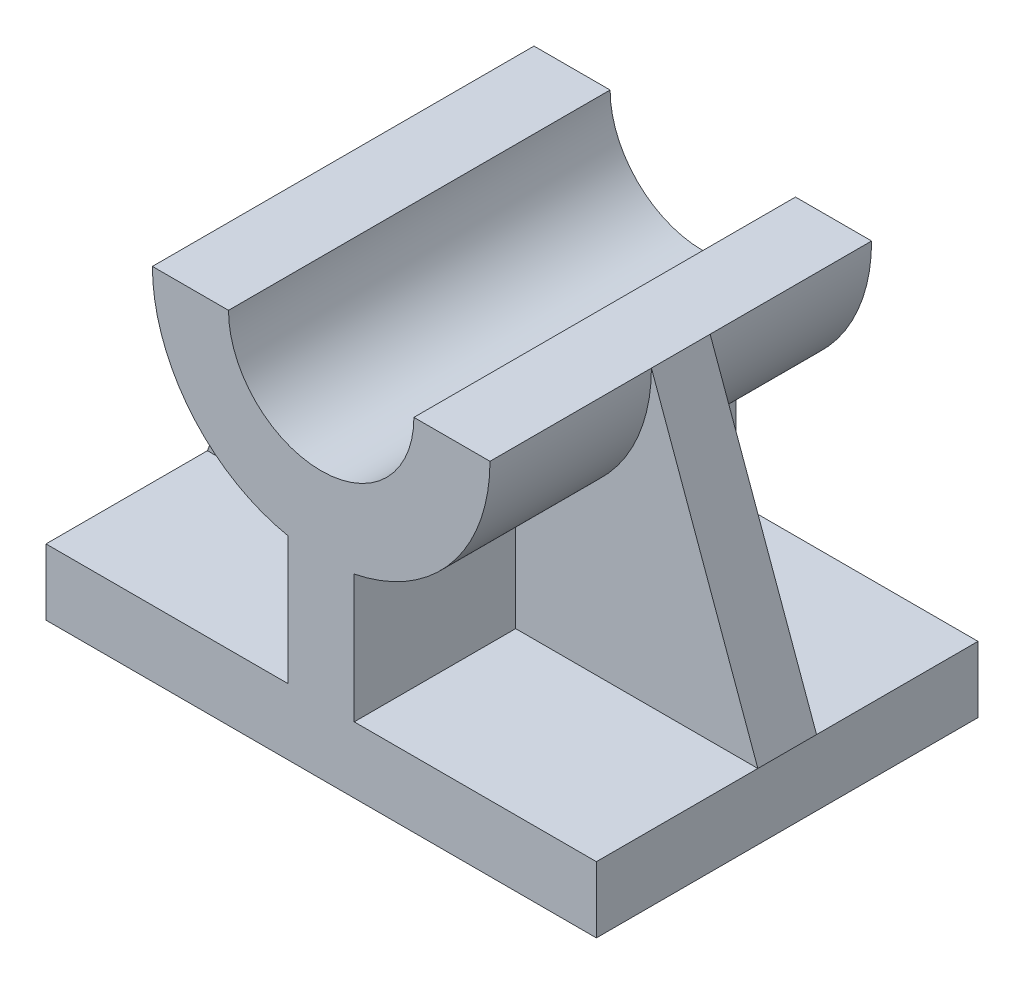
ISO-10303-21;
HEADER;
FILE_DESCRIPTION(('STEP AP214'),'2;1');
FILE_NAME('part.step','',(''),(''),'','','');
FILE_SCHEMA(('AUTOMOTIVE_DESIGN { 1 0 10303 214 1 1 1 1 }'));
ENDSEC;
DATA;
#1=APPLICATION_CONTEXT('core data for automotive mechanical design processes');
#2=APPLICATION_PROTOCOL_DEFINITION('international standard','automotive_design',2000,#1);
#3=PRODUCT_CONTEXT('',#1,'mechanical');
#4=PRODUCT('Part','Part','',(#3));
#5=PRODUCT_RELATED_PRODUCT_CATEGORY('part','',(#4));
#6=PRODUCT_DEFINITION_FORMATION('','',#4);
#7=PRODUCT_DEFINITION_CONTEXT('part definition',#1,'design');
#8=PRODUCT_DEFINITION('design','',#6,#7);
#9=PRODUCT_DEFINITION_SHAPE('','',#8);
#10=(LENGTH_UNIT() NAMED_UNIT(*) SI_UNIT(.MILLI.,.METRE.));
#11=(NAMED_UNIT(*) PLANE_ANGLE_UNIT() SI_UNIT($,.RADIAN.));
#12=(NAMED_UNIT(*) SI_UNIT($,.STERADIAN.) SOLID_ANGLE_UNIT());
#13=UNCERTAINTY_MEASURE_WITH_UNIT(LENGTH_MEASURE(1.E-05),#10,'distance_accuracy_value','');
#14=(GEOMETRIC_REPRESENTATION_CONTEXT(3) GLOBAL_UNCERTAINTY_ASSIGNED_CONTEXT((#13)) GLOBAL_UNIT_ASSIGNED_CONTEXT((#10,
#11,#12)) REPRESENTATION_CONTEXT('',''));
#15=CARTESIAN_POINT('',(0.,0.,0.));
#16=DIRECTION('',(0.,0.,1.));
#17=DIRECTION('',(1.,0.,0.));
#18=AXIS2_PLACEMENT_3D('',#15,#16,#17);
#19=CARTESIAN_POINT('',(0.,44500.,26000.));
#20=DIRECTION('',(0.,0.,-1.));
#21=DIRECTION('',(-1.,0.,0.));
#22=AXIS2_PLACEMENT_3D('',#19,#20,#21);
#23=CYLINDRICAL_SURFACE('',#22,23000.);
#24=CARTESIAN_POINT('',(0.,44500.,-4000.));
#25=DIRECTION('',(0.,0.,1.));
#26=DIRECTION('',(1.,0.,0.));
#27=AXIS2_PLACEMENT_3D('',#24,#25,#26);
#28=CIRCLE('',#27,23000.);
#29=CARTESIAN_POINT('',(-23000.,44500.,-4000.));
#30=VERTEX_POINT('',#29);
#31=CARTESIAN_POINT('',(-4500.00000000001,21944.5128627201,-4000.));
#32=VERTEX_POINT('',#31);
#33=EDGE_CURVE('E190',#30,#32,#28,.T.);
#34=ORIENTED_EDGE('',*,*,#33,.F.);
#35=DIRECTION('',(0.,0.,-1.));
#36=VECTOR('',#35,1.);
#37=CARTESIAN_POINT('',(-23000.,44500.,26000.));
#38=LINE('',#37,#36);
#39=CARTESIAN_POINT('',(-23000.,44500.,-26000.));
#40=VERTEX_POINT('',#39);
#41=EDGE_CURVE('E199',#30,#40,#38,.T.);
#42=ORIENTED_EDGE('',*,*,#41,.T.);
#43=CARTESIAN_POINT('',(0.,44500.,-26000.));
#44=DIRECTION('',(0.,0.,1.));
#45=DIRECTION('',(1.,0.,0.));
#46=AXIS2_PLACEMENT_3D('',#43,#44,#45);
#47=CIRCLE('',#46,23000.);
#48=CARTESIAN_POINT('',(-4500.00000000001,21944.5128627201,-26000.));
#49=VERTEX_POINT('',#48);
#50=EDGE_CURVE('E272',#40,#49,#47,.T.);
#51=ORIENTED_EDGE('',*,*,#50,.T.);
#52=DIRECTION('',(0.,0.,-1.));
#53=VECTOR('',#52,1.);
#54=CARTESIAN_POINT('',(-4500.00000000001,21944.5128627201,26000.));
#55=LINE('',#54,#53);
#56=EDGE_CURVE('E201',#32,#49,#55,.T.);
#57=ORIENTED_EDGE('',*,*,#56,.F.);
#58=EDGE_LOOP('',(#34,#42,#51,#57));
#59=FACE_BOUND('',#58,.T.);
#60=ADVANCED_FACE('F41',(#59),#23,.T.);
#61=CARTESIAN_POINT('',(-4500.00000000001,21944.5128627201,26000.));
#62=DIRECTION('',(1.,0.,0.));
#63=DIRECTION('',(0.,1.,0.));
#64=AXIS2_PLACEMENT_3D('',#61,#62,#63);
#65=PLANE('',#64);
#66=DIRECTION('',(0.,-1.,0.));
#67=VECTOR('',#66,1.);
#68=CARTESIAN_POINT('',(-4500.00000000001,21944.5128627201,-4000.));
#69=LINE('',#68,#67);
#70=CARTESIAN_POINT('',(-4500.00000000001,4500.,-4000.));
#71=VERTEX_POINT('',#70);
#72=EDGE_CURVE('E203',#32,#71,#69,.T.);
#73=ORIENTED_EDGE('',*,*,#72,.F.);
#74=ORIENTED_EDGE('',*,*,#56,.T.);
#75=DIRECTION('',(0.,-1.,0.));
#76=VECTOR('',#75,1.);
#77=CARTESIAN_POINT('',(-4500.00000000001,21944.5128627201,-26000.));
#78=LINE('',#77,#76);
#79=CARTESIAN_POINT('',(-4500.00000000001,4500.,-26000.));
#80=VERTEX_POINT('',#79);
#81=EDGE_CURVE('E274',#49,#80,#78,.T.);
#82=ORIENTED_EDGE('',*,*,#81,.T.);
#83=DIRECTION('',(0.,0.,-1.));
#84=VECTOR('',#83,1.);
#85=CARTESIAN_POINT('',(-4500.00000000001,4500.,26000.));
#86=LINE('',#85,#84);
#87=EDGE_CURVE('E295',#71,#80,#86,.T.);
#88=ORIENTED_EDGE('',*,*,#87,.F.);
#89=EDGE_LOOP('',(#73,#74,#82,#88));
#90=FACE_BOUND('',#89,.T.);
#91=ADVANCED_FACE('F310',(#90),#65,.F.);
#92=CARTESIAN_POINT('',(-37500.,4500.,26000.));
#93=DIRECTION('',(0.,-1.,0.));
#94=DIRECTION('',(0.,0.,-1.));
#95=AXIS2_PLACEMENT_3D('',#92,#93,#94);
#96=PLANE('',#95);
#97=DIRECTION('',(-1.,0.,0.));
#98=VECTOR('',#97,1.);
#99=CARTESIAN_POINT('',(-37500.,4500.,-4000.));
#100=LINE('',#99,#98);
#101=CARTESIAN_POINT('',(-37500.,4500.,-4000.));
#102=VERTEX_POINT('',#101);
#103=EDGE_CURVE('E193',#71,#102,#100,.T.);
#104=ORIENTED_EDGE('',*,*,#103,.F.);
#105=ORIENTED_EDGE('',*,*,#87,.T.);
#106=DIRECTION('',(-1.,0.,0.));
#107=VECTOR('',#106,1.);
#108=CARTESIAN_POINT('',(-37500.,4500.,-26000.));
#109=LINE('',#108,#107);
#110=CARTESIAN_POINT('',(-37500.,4500.,-26000.));
#111=VERTEX_POINT('',#110);
#112=EDGE_CURVE('E277',#80,#111,#109,.T.);
#113=ORIENTED_EDGE('',*,*,#112,.T.);
#114=DIRECTION('',(0.,0.,-1.));
#115=VECTOR('',#114,1.);
#116=CARTESIAN_POINT('',(-37500.,4500.,26000.));
#117=LINE('',#116,#115);
#118=EDGE_CURVE('E292',#102,#111,#117,.T.);
#119=ORIENTED_EDGE('',*,*,#118,.F.);
#120=EDGE_LOOP('',(#104,#105,#113,#119));
#121=FACE_BOUND('',#120,.T.);
#122=ADVANCED_FACE('F305',(#121),#96,.F.);
#123=CARTESIAN_POINT('',(4500.,4500.00000000003,26000.));
#124=DIRECTION('',(0.,-1.,0.));
#125=DIRECTION('',(1.,0.,0.));
#126=AXIS2_PLACEMENT_3D('',#123,#124,#125);
#127=PLANE('',#126);
#128=DIRECTION('',(-1.,0.,0.));
#129=VECTOR('',#128,1.);
#130=CARTESIAN_POINT('',(4500.,4500.00000000003,-4000.));
#131=LINE('',#130,#129);
#132=CARTESIAN_POINT('',(37500.,4499.99999999999,-4000.));
#133=VERTEX_POINT('',#132);
#134=CARTESIAN_POINT('',(4500.,4500.00000000003,-4000.));
#135=VERTEX_POINT('',#134);
#136=EDGE_CURVE('E337',#133,#135,#131,.T.);
#137=ORIENTED_EDGE('',*,*,#136,.F.);
#138=DIRECTION('',(0.,0.,-1.));
#139=VECTOR('',#138,1.);
#140=CARTESIAN_POINT('',(37500.,4500.,26000.));
#141=LINE('',#140,#139);
#142=CARTESIAN_POINT('',(37500.,4500.,-26000.));
#143=VERTEX_POINT('',#142);
#144=EDGE_CURVE('E49',#133,#143,#141,.T.);
#145=ORIENTED_EDGE('',*,*,#144,.T.);
#146=DIRECTION('',(-1.,0.,0.));
#147=VECTOR('',#146,1.);
#148=CARTESIAN_POINT('',(4500.,4500.00000000003,-26000.));
#149=LINE('',#148,#147);
#150=CARTESIAN_POINT('',(4500.,4500.00000000003,-26000.));
#151=VERTEX_POINT('',#150);
#152=EDGE_CURVE('E249',#143,#151,#149,.T.);
#153=ORIENTED_EDGE('',*,*,#152,.T.);
#154=DIRECTION('',(0.,0.,-1.));
#155=VECTOR('',#154,1.);
#156=CARTESIAN_POINT('',(4500.,4500.00000000003,26000.));
#157=LINE('',#156,#155);
#158=EDGE_CURVE('E228',#135,#151,#157,.T.);
#159=ORIENTED_EDGE('',*,*,#158,.F.);
#160=EDGE_LOOP('',(#137,#145,#153,#159));
#161=FACE_BOUND('',#160,.T.);
#162=ADVANCED_FACE('F250',(#161),#127,.F.);
#163=CARTESIAN_POINT('',(4500.00000000001,21944.5128627201,26000.));
#164=DIRECTION('',(-1.,0.,0.));
#165=DIRECTION('',(0.,-1.,0.));
#166=AXIS2_PLACEMENT_3D('',#163,#164,#165);
#167=PLANE('',#166);
#168=DIRECTION('',(0.,1.,0.));
#169=VECTOR('',#168,1.);
#170=CARTESIAN_POINT('',(4500.00000000001,21944.5128627201,-4000.));
#171=LINE('',#170,#169);
#172=CARTESIAN_POINT('',(4500.00000000001,21944.5128627201,-4000.));
#173=VERTEX_POINT('',#172);
#174=EDGE_CURVE('E245',#135,#173,#171,.T.);
#175=ORIENTED_EDGE('',*,*,#174,.F.);
#176=ORIENTED_EDGE('',*,*,#158,.T.);
#177=DIRECTION('',(0.,1.,0.));
#178=VECTOR('',#177,1.);
#179=CARTESIAN_POINT('',(4500.00000000001,21944.5128627201,-26000.));
#180=LINE('',#179,#178);
#181=CARTESIAN_POINT('',(4500.00000000001,21944.5128627201,-26000.));
#182=VERTEX_POINT('',#181);
#183=EDGE_CURVE('E243',#151,#182,#180,.T.);
#184=ORIENTED_EDGE('',*,*,#183,.T.);
#185=DIRECTION('',(0.,0.,-1.));
#186=VECTOR('',#185,1.);
#187=CARTESIAN_POINT('',(4500.00000000001,21944.5128627201,26000.));
#188=LINE('',#187,#186);
#189=EDGE_CURVE('E224',#173,#182,#188,.T.);
#190=ORIENTED_EDGE('',*,*,#189,.F.);
#191=EDGE_LOOP('',(#175,#176,#184,#190));
#192=FACE_BOUND('',#191,.T.);
#193=ADVANCED_FACE('F240',(#192),#167,.F.);
#194=CARTESIAN_POINT('',(0.,44500.,26000.));
#195=DIRECTION('',(0.,0.,-1.));
#196=DIRECTION('',(-1.,0.,0.));
#197=AXIS2_PLACEMENT_3D('',#194,#195,#196);
#198=CYLINDRICAL_SURFACE('',#197,23000.);
#199=CARTESIAN_POINT('',(0.,44500.,-4000.));
#200=DIRECTION('',(0.,0.,1.));
#201=DIRECTION('',(1.,0.,0.));
#202=AXIS2_PLACEMENT_3D('',#199,#200,#201);
#203=CIRCLE('',#202,23000.);
#204=CARTESIAN_POINT('',(23000.,44500.,-4000.));
#205=VERTEX_POINT('',#204);
#206=EDGE_CURVE('E333',#173,#205,#203,.T.);
#207=ORIENTED_EDGE('',*,*,#206,.F.);
#208=ORIENTED_EDGE('',*,*,#189,.T.);
#209=CARTESIAN_POINT('',(0.,44500.,-26000.));
#210=DIRECTION('',(0.,0.,1.));
#211=DIRECTION('',(1.,0.,0.));
#212=AXIS2_PLACEMENT_3D('',#209,#210,#211);
#213=CIRCLE('',#212,23000.);
#214=CARTESIAN_POINT('',(23000.,44500.,-26000.));
#215=VERTEX_POINT('',#214);
#216=EDGE_CURVE('E260',#182,#215,#213,.T.);
#217=ORIENTED_EDGE('',*,*,#216,.T.);
#218=DIRECTION('',(0.,0.,-1.));
#219=VECTOR('',#218,1.);
#220=CARTESIAN_POINT('',(23000.,44500.,26000.));
#221=LINE('',#220,#219);
#222=EDGE_CURVE('E220',#205,#215,#221,.T.);
#223=ORIENTED_EDGE('',*,*,#222,.F.);
#224=EDGE_LOOP('',(#207,#208,#217,#223));
#225=FACE_BOUND('',#224,.T.);
#226=ADVANCED_FACE('F403',(#225),#198,.T.);
#227=CARTESIAN_POINT('',(37500.,4500.,26000.));
#228=DIRECTION('',(-1.,0.,0.));
#229=DIRECTION('',(0.,0.,1.));
#230=AXIS2_PLACEMENT_3D('',#227,#228,#229);
#231=PLANE('',#230);
#232=DIRECTION('',(0.,0.,-1.));
#233=VECTOR('',#232,1.);
#234=CARTESIAN_POINT('',(37500.,-4500.,26000.));
#235=LINE('',#234,#233);
#236=CARTESIAN_POINT('',(37500.,-4500.,26000.));
#237=VERTEX_POINT('',#236);
#238=CARTESIAN_POINT('',(37500.,-4500.,-26000.));
#239=VERTEX_POINT('',#238);
#240=EDGE_CURVE('E287',#237,#239,#235,.T.);
#241=ORIENTED_EDGE('',*,*,#240,.T.);
#242=DIRECTION('',(0.,1.,0.));
#243=VECTOR('',#242,1.);
#244=CARTESIAN_POINT('',(37500.,4500.,-26000.));
#245=LINE('',#244,#243);
#246=EDGE_CURVE('E255',#239,#143,#245,.T.);
#247=ORIENTED_EDGE('',*,*,#246,.T.);
#248=ORIENTED_EDGE('',*,*,#144,.F.);
#249=DIRECTION('',(0.,0.,-1.));
#250=VECTOR('',#249,1.);
#251=CARTESIAN_POINT('',(37500.,4500.,26000.));
#252=LINE('',#251,#250);
#253=CARTESIAN_POINT('',(37500.,4499.99999999999,4000.));
#254=VERTEX_POINT('',#253);
#255=EDGE_CURVE('E347',#133,#254,#252,.F.);
#256=ORIENTED_EDGE('',*,*,#255,.T.);
#257=CARTESIAN_POINT('',(37500.,4500.,26000.));
#258=VERTEX_POINT('',#257);
#259=EDGE_CURVE('E11',#258,#254,#141,.T.);
#260=ORIENTED_EDGE('',*,*,#259,.F.);
#261=DIRECTION('',(0.,1.,0.));
#262=VECTOR('',#261,1.);
#263=CARTESIAN_POINT('',(37500.,4500.,26000.));
#264=LINE('',#263,#262);
#265=EDGE_CURVE('E286',#237,#258,#264,.T.);
#266=ORIENTED_EDGE('',*,*,#265,.F.);
#267=EDGE_LOOP('',(#241,#247,#248,#256,#260,#266));
#268=FACE_BOUND('',#267,.T.);
#269=ADVANCED_FACE('F43',(#268),#231,.F.);
#270=ORIENTED_EDGE('',*,*,#259,.T.);
#271=DIRECTION('',(-1.,0.,0.));
#272=VECTOR('',#271,1.);
#273=CARTESIAN_POINT('',(4500.,4500.00000000003,4000.));
#274=LINE('',#273,#272);
#275=CARTESIAN_POINT('',(4500.,4500.00000000003,4000.));
#276=VERTEX_POINT('',#275);
#277=EDGE_CURVE('E344',#254,#276,#274,.T.);
#278=ORIENTED_EDGE('',*,*,#277,.T.);
#279=CARTESIAN_POINT('',(4500.,4500.00000000003,26000.));
#280=VERTEX_POINT('',#279);
#281=EDGE_CURVE('E229',#280,#276,#157,.T.);
#282=ORIENTED_EDGE('',*,*,#281,.F.);
#283=DIRECTION('',(-1.,0.,0.));
#284=VECTOR('',#283,1.);
#285=CARTESIAN_POINT('',(4500.,4500.00000000003,26000.));
#286=LINE('',#285,#284);
#287=EDGE_CURVE('E352',#258,#280,#286,.T.);
#288=ORIENTED_EDGE('',*,*,#287,.F.);
#289=EDGE_LOOP('',(#270,#278,#282,#288));
#290=FACE_BOUND('',#289,.T.);
#291=ADVANCED_FACE('F443',(#290),#127,.F.);
#292=ORIENTED_EDGE('',*,*,#281,.T.);
#293=DIRECTION('',(0.,1.,0.));
#294=VECTOR('',#293,1.);
#295=CARTESIAN_POINT('',(4500.00000000001,21944.5128627201,4000.));
#296=LINE('',#295,#294);
#297=CARTESIAN_POINT('',(4500.00000000001,21944.5128627201,4000.));
#298=VERTEX_POINT('',#297);
#299=EDGE_CURVE('E342',#276,#298,#296,.T.);
#300=ORIENTED_EDGE('',*,*,#299,.T.);
#301=CARTESIAN_POINT('',(4500.00000000001,21944.5128627201,26000.));
#302=VERTEX_POINT('',#301);
#303=EDGE_CURVE('E226',#302,#298,#188,.T.);
#304=ORIENTED_EDGE('',*,*,#303,.F.);
#305=DIRECTION('',(0.,1.,0.));
#306=VECTOR('',#305,1.);
#307=CARTESIAN_POINT('',(4500.00000000001,21944.5128627201,26000.));
#308=LINE('',#307,#306);
#309=EDGE_CURVE('E354',#280,#302,#308,.T.);
#310=ORIENTED_EDGE('',*,*,#309,.F.);
#311=EDGE_LOOP('',(#292,#300,#304,#310));
#312=FACE_BOUND('',#311,.T.);
#313=ADVANCED_FACE('F440',(#312),#167,.F.);
#314=ORIENTED_EDGE('',*,*,#303,.T.);
#315=CARTESIAN_POINT('',(0.,44500.,4000.));
#316=DIRECTION('',(0.,0.,1.));
#317=DIRECTION('',(1.,0.,0.));
#318=AXIS2_PLACEMENT_3D('',#315,#316,#317);
#319=CIRCLE('',#318,23000.);
#320=CARTESIAN_POINT('',(23000.,44500.,4000.));
#321=VERTEX_POINT('',#320);
#322=EDGE_CURVE('E339',#298,#321,#319,.T.);
#323=ORIENTED_EDGE('',*,*,#322,.T.);
#324=CARTESIAN_POINT('',(23000.,44500.,26000.));
#325=VERTEX_POINT('',#324);
#326=EDGE_CURVE('E221',#325,#321,#221,.T.);
#327=ORIENTED_EDGE('',*,*,#326,.F.);
#328=CARTESIAN_POINT('',(0.,44500.,26000.));
#329=DIRECTION('',(0.,0.,1.));
#330=DIRECTION('',(1.,0.,0.));
#331=AXIS2_PLACEMENT_3D('',#328,#329,#330);
#332=CIRCLE('',#331,23000.);
#333=EDGE_CURVE('E356',#302,#325,#332,.T.);
#334=ORIENTED_EDGE('',*,*,#333,.F.);
#335=EDGE_LOOP('',(#314,#323,#327,#334));
#336=FACE_BOUND('',#335,.T.);
#337=ADVANCED_FACE('F437',(#336),#198,.T.);
#338=CARTESIAN_POINT('',(23000.,44500.,26000.));
#339=DIRECTION('',(0.,-1.,0.));
#340=DIRECTION('',(0.,0.,-1.));
#341=AXIS2_PLACEMENT_3D('',#338,#339,#340);
#342=PLANE('',#341);
#343=ORIENTED_EDGE('',*,*,#326,.T.);
#344=EDGE_CURVE('E225',#321,#205,#221,.T.);
#345=ORIENTED_EDGE('',*,*,#344,.T.);
#346=ORIENTED_EDGE('',*,*,#222,.T.);
#347=DIRECTION('',(-1.,0.,0.));
#348=VECTOR('',#347,1.);
#349=CARTESIAN_POINT('',(23000.,44500.,-26000.));
#350=LINE('',#349,#348);
#351=CARTESIAN_POINT('',(12632.3716415069,44500.,-26000.));
#352=VERTEX_POINT('',#351);
#353=EDGE_CURVE('E262',#215,#352,#350,.T.);
#354=ORIENTED_EDGE('',*,*,#353,.T.);
#355=DIRECTION('',(0.,0.,-1.));
#356=VECTOR('',#355,1.);
#357=CARTESIAN_POINT('',(12632.3716415069,44500.,26000.));
#358=LINE('',#357,#356);
#359=CARTESIAN_POINT('',(12632.3716415069,44500.,26000.));
#360=VERTEX_POINT('',#359);
#361=EDGE_CURVE('E218',#360,#352,#358,.T.);
#362=ORIENTED_EDGE('',*,*,#361,.F.);
#363=DIRECTION('',(-1.,0.,0.));
#364=VECTOR('',#363,1.);
#365=CARTESIAN_POINT('',(23000.,44500.,26000.));
#366=LINE('',#365,#364);
#367=EDGE_CURVE('E358',#325,#360,#366,.T.);
#368=ORIENTED_EDGE('',*,*,#367,.F.);
#369=EDGE_LOOP('',(#343,#345,#346,#354,#362,#368));
#370=FACE_BOUND('',#369,.T.);
#371=ADVANCED_FACE('F398',(#370),#342,.F.);
#372=CARTESIAN_POINT('',(0.,44500.,26000.));
#373=DIRECTION('',(0.,0.,-1.));
#374=DIRECTION('',(-1.,0.,0.));
#375=AXIS2_PLACEMENT_3D('',#372,#373,#374);
#376=CYLINDRICAL_SURFACE('',#375,12632.3716415069);
#377=ORIENTED_EDGE('',*,*,#361,.T.);
#378=CARTESIAN_POINT('',(0.,44500.,-26000.));
#379=DIRECTION('',(0.,0.,-1.));
#380=DIRECTION('',(1.,0.,0.));
#381=AXIS2_PLACEMENT_3D('',#378,#379,#380);
#382=CIRCLE('',#381,12632.3716415069);
#383=CARTESIAN_POINT('',(-12632.3716415069,44500.,-26000.));
#384=VERTEX_POINT('',#383);
#385=EDGE_CURVE('E268',#352,#384,#382,.T.);
#386=ORIENTED_EDGE('',*,*,#385,.T.);
#387=DIRECTION('',(0.,0.,-1.));
#388=VECTOR('',#387,1.);
#389=CARTESIAN_POINT('',(-12632.3716415069,44500.,26000.));
#390=LINE('',#389,#388);
#391=CARTESIAN_POINT('',(-12632.3716415069,44500.,26000.));
#392=VERTEX_POINT('',#391);
#393=EDGE_CURVE('E212',#392,#384,#390,.T.);
#394=ORIENTED_EDGE('',*,*,#393,.F.);
#395=CARTESIAN_POINT('',(0.,44500.,26000.));
#396=DIRECTION('',(0.,0.,-1.));
#397=DIRECTION('',(1.,0.,0.));
#398=AXIS2_PLACEMENT_3D('',#395,#396,#397);
#399=CIRCLE('',#398,12632.3716415069);
#400=EDGE_CURVE('E360',#360,#392,#399,.T.);
#401=ORIENTED_EDGE('',*,*,#400,.F.);
#402=EDGE_LOOP('',(#377,#386,#394,#401));
#403=FACE_BOUND('',#402,.T.);
#404=ADVANCED_FACE('F395',(#403),#376,.F.);
#405=CARTESIAN_POINT('',(-12632.3716415069,44500.,26000.));
#406=DIRECTION('',(0.,-1.,0.));
#407=DIRECTION('',(0.,0.,-1.));
#408=AXIS2_PLACEMENT_3D('',#405,#406,#407);
#409=PLANE('',#408);
#410=ORIENTED_EDGE('',*,*,#393,.T.);
#411=DIRECTION('',(-1.,0.,0.));
#412=VECTOR('',#411,1.);
#413=CARTESIAN_POINT('',(-12632.3716415069,44500.,-26000.));
#414=LINE('',#413,#412);
#415=EDGE_CURVE('E207',#384,#40,#414,.T.);
#416=ORIENTED_EDGE('',*,*,#415,.T.);
#417=ORIENTED_EDGE('',*,*,#41,.F.);
#418=DIRECTION('',(0.,0.,-1.));
#419=VECTOR('',#418,1.);
#420=CARTESIAN_POINT('',(-23000.,44500.,26000.));
#421=LINE('',#420,#419);
#422=CARTESIAN_POINT('',(-23000.,44500.,4000.));
#423=VERTEX_POINT('',#422);
#424=EDGE_CURVE('E177',#30,#423,#421,.F.);
#425=ORIENTED_EDGE('',*,*,#424,.T.);
#426=CARTESIAN_POINT('',(-23000.,44500.,26000.));
#427=VERTEX_POINT('',#426);
#428=EDGE_CURVE('E209',#427,#423,#38,.T.);
#429=ORIENTED_EDGE('',*,*,#428,.F.);
#430=DIRECTION('',(-1.,0.,0.));
#431=VECTOR('',#430,1.);
#432=CARTESIAN_POINT('',(-12632.3716415069,44500.,26000.));
#433=LINE('',#432,#431);
#434=EDGE_CURVE('E362',#392,#427,#433,.T.);
#435=ORIENTED_EDGE('',*,*,#434,.F.);
#436=EDGE_LOOP('',(#410,#416,#417,#425,#429,#435));
#437=FACE_BOUND('',#436,.T.);
#438=ADVANCED_FACE('F205',(#437),#409,.F.);
#439=ORIENTED_EDGE('',*,*,#428,.T.);
#440=CARTESIAN_POINT('',(0.,44500.,4000.));
#441=DIRECTION('',(0.,0.,1.));
#442=DIRECTION('',(1.,0.,0.));
#443=AXIS2_PLACEMENT_3D('',#440,#441,#442);
#444=CIRCLE('',#443,23000.);
#445=CARTESIAN_POINT('',(-4500.00000000001,21944.5128627201,4000.));
#446=VERTEX_POINT('',#445);
#447=EDGE_CURVE('E202',#423,#446,#444,.T.);
#448=ORIENTED_EDGE('',*,*,#447,.T.);
#449=CARTESIAN_POINT('',(-4500.00000000001,21944.5128627201,26000.));
#450=VERTEX_POINT('',#449);
#451=EDGE_CURVE('E210',#450,#446,#55,.T.);
#452=ORIENTED_EDGE('',*,*,#451,.F.);
#453=CARTESIAN_POINT('',(0.,44500.,26000.));
#454=DIRECTION('',(0.,0.,1.));
#455=DIRECTION('',(1.,0.,0.));
#456=AXIS2_PLACEMENT_3D('',#453,#454,#455);
#457=CIRCLE('',#456,23000.);
#458=EDGE_CURVE('E364',#427,#450,#457,.T.);
#459=ORIENTED_EDGE('',*,*,#458,.F.);
#460=EDGE_LOOP('',(#439,#448,#452,#459));
#461=FACE_BOUND('',#460,.T.);
#462=ADVANCED_FACE('F386',(#461),#23,.T.);
#463=ORIENTED_EDGE('',*,*,#451,.T.);
#464=DIRECTION('',(0.,-1.,0.));
#465=VECTOR('',#464,1.);
#466=CARTESIAN_POINT('',(-4500.00000000001,21944.5128627201,4000.));
#467=LINE('',#466,#465);
#468=CARTESIAN_POINT('',(-4500.00000000001,4500.,4000.));
#469=VERTEX_POINT('',#468);
#470=EDGE_CURVE('E325',#446,#469,#467,.T.);
#471=ORIENTED_EDGE('',*,*,#470,.T.);
#472=CARTESIAN_POINT('',(-4500.00000000001,4500.,26000.));
#473=VERTEX_POINT('',#472);
#474=EDGE_CURVE('E297',#473,#469,#86,.T.);
#475=ORIENTED_EDGE('',*,*,#474,.F.);
#476=DIRECTION('',(0.,-1.,0.));
#477=VECTOR('',#476,1.);
#478=CARTESIAN_POINT('',(-4500.00000000001,21944.5128627201,26000.));
#479=LINE('',#478,#477);
#480=EDGE_CURVE('E366',#450,#473,#479,.T.);
#481=ORIENTED_EDGE('',*,*,#480,.F.);
#482=EDGE_LOOP('',(#463,#471,#475,#481));
#483=FACE_BOUND('',#482,.T.);
#484=ADVANCED_FACE('F384',(#483),#65,.F.);
#485=ORIENTED_EDGE('',*,*,#474,.T.);
#486=DIRECTION('',(-1.,0.,0.));
#487=VECTOR('',#486,1.);
#488=CARTESIAN_POINT('',(-37500.,4500.,4000.));
#489=LINE('',#488,#487);
#490=CARTESIAN_POINT('',(-37500.,4499.99999999996,4000.));
#491=VERTEX_POINT('',#490);
#492=EDGE_CURVE('E185',#469,#491,#489,.T.);
#493=ORIENTED_EDGE('',*,*,#492,.T.);
#494=CARTESIAN_POINT('',(-37500.,4500.,26000.));
#495=VERTEX_POINT('',#494);
#496=EDGE_CURVE('E293',#495,#491,#117,.T.);
#497=ORIENTED_EDGE('',*,*,#496,.F.);
#498=DIRECTION('',(-1.,0.,0.));
#499=VECTOR('',#498,1.);
#500=CARTESIAN_POINT('',(-37500.,4500.,26000.));
#501=LINE('',#500,#499);
#502=EDGE_CURVE('E368',#473,#495,#501,.T.);
#503=ORIENTED_EDGE('',*,*,#502,.F.);
#504=EDGE_LOOP('',(#485,#493,#497,#503));
#505=FACE_BOUND('',#504,.T.);
#506=ADVANCED_FACE('F324',(#505),#96,.F.);
#507=CARTESIAN_POINT('',(-37500.,4500.,26000.));
#508=DIRECTION('',(1.,0.,0.));
#509=DIRECTION('',(0.,0.,-1.));
#510=AXIS2_PLACEMENT_3D('',#507,#508,#509);
#511=PLANE('',#510);
#512=ORIENTED_EDGE('',*,*,#496,.T.);
#513=EDGE_CURVE('E296',#491,#102,#117,.T.);
#514=ORIENTED_EDGE('',*,*,#513,.T.);
#515=ORIENTED_EDGE('',*,*,#118,.T.);
#516=DIRECTION('',(0.,-1.,0.));
#517=VECTOR('',#516,1.);
#518=CARTESIAN_POINT('',(-37500.,4500.,-26000.));
#519=LINE('',#518,#517);
#520=CARTESIAN_POINT('',(-37500.,-4500.,-26000.));
#521=VERTEX_POINT('',#520);
#522=EDGE_CURVE('E280',#111,#521,#519,.T.);
#523=ORIENTED_EDGE('',*,*,#522,.T.);
#524=DIRECTION('',(0.,0.,-1.));
#525=VECTOR('',#524,1.);
#526=CARTESIAN_POINT('',(-37500.,-4500.,26000.));
#527=LINE('',#526,#525);
#528=CARTESIAN_POINT('',(-37500.,-4500.,26000.));
#529=VERTEX_POINT('',#528);
#530=EDGE_CURVE('E289',#529,#521,#527,.T.);
#531=ORIENTED_EDGE('',*,*,#530,.F.);
#532=DIRECTION('',(0.,-1.,0.));
#533=VECTOR('',#532,1.);
#534=CARTESIAN_POINT('',(-37500.,4500.,26000.));
#535=LINE('',#534,#533);
#536=EDGE_CURVE('E370',#495,#529,#535,.T.);
#537=ORIENTED_EDGE('',*,*,#536,.F.);
#538=EDGE_LOOP('',(#512,#514,#515,#523,#531,#537));
#539=FACE_BOUND('',#538,.T.);
#540=ADVANCED_FACE('F314',(#539),#511,.F.);
#541=CARTESIAN_POINT('',(-37500.,-4500.,26000.));
#542=DIRECTION('',(0.,1.,0.));
#543=DIRECTION('',(0.,0.,1.));
#544=AXIS2_PLACEMENT_3D('',#541,#542,#543);
#545=PLANE('',#544);
#546=ORIENTED_EDGE('',*,*,#530,.T.);
#547=DIRECTION('',(1.,0.,0.));
#548=VECTOR('',#547,1.);
#549=CARTESIAN_POINT('',(-37500.,-4500.,-26000.));
#550=LINE('',#549,#548);
#551=EDGE_CURVE('E283',#521,#239,#550,.T.);
#552=ORIENTED_EDGE('',*,*,#551,.T.);
#553=ORIENTED_EDGE('',*,*,#240,.F.);
#554=DIRECTION('',(1.,0.,0.));
#555=VECTOR('',#554,1.);
#556=CARTESIAN_POINT('',(-37500.,-4500.,26000.));
#557=LINE('',#556,#555);
#558=EDGE_CURVE('E290',#529,#237,#557,.T.);
#559=ORIENTED_EDGE('',*,*,#558,.F.);
#560=EDGE_LOOP('',(#546,#552,#553,#559));
#561=FACE_BOUND('',#560,.T.);
#562=ADVANCED_FACE('F377',(#561),#545,.F.);
#563=CARTESIAN_POINT('',(0.,44500.,26000.));
#564=DIRECTION('',(0.,0.,1.));
#565=DIRECTION('',(1.,0.,0.));
#566=AXIS2_PLACEMENT_3D('',#563,#564,#565);
#567=PLANE('',#566);
#568=ORIENTED_EDGE('',*,*,#265,.T.);
#569=ORIENTED_EDGE('',*,*,#287,.T.);
#570=ORIENTED_EDGE('',*,*,#309,.T.);
#571=ORIENTED_EDGE('',*,*,#333,.T.);
#572=ORIENTED_EDGE('',*,*,#367,.T.);
#573=ORIENTED_EDGE('',*,*,#400,.T.);
#574=ORIENTED_EDGE('',*,*,#434,.T.);
#575=ORIENTED_EDGE('',*,*,#458,.T.);
#576=ORIENTED_EDGE('',*,*,#480,.T.);
#577=ORIENTED_EDGE('',*,*,#502,.T.);
#578=ORIENTED_EDGE('',*,*,#536,.T.);
#579=ORIENTED_EDGE('',*,*,#558,.T.);
#580=EDGE_LOOP('',(#568,#569,#570,#571,#572,#573,#574,#575,#576,#577,#578,#579));
#581=FACE_BOUND('',#580,.T.);
#582=ADVANCED_FACE('F379',(#581),#567,.T.);
#583=CARTESIAN_POINT('',(0.,44500.,-26000.));
#584=DIRECTION('',(0.,0.,1.));
#585=DIRECTION('',(1.,0.,0.));
#586=AXIS2_PLACEMENT_3D('',#583,#584,#585);
#587=PLANE('',#586);
#588=ORIENTED_EDGE('',*,*,#246,.F.);
#589=ORIENTED_EDGE('',*,*,#551,.F.);
#590=ORIENTED_EDGE('',*,*,#522,.F.);
#591=ORIENTED_EDGE('',*,*,#112,.F.);
#592=ORIENTED_EDGE('',*,*,#81,.F.);
#593=ORIENTED_EDGE('',*,*,#50,.F.);
#594=ORIENTED_EDGE('',*,*,#415,.F.);
#595=ORIENTED_EDGE('',*,*,#385,.F.);
#596=ORIENTED_EDGE('',*,*,#353,.F.);
#597=ORIENTED_EDGE('',*,*,#216,.F.);
#598=ORIENTED_EDGE('',*,*,#183,.F.);
#599=ORIENTED_EDGE('',*,*,#152,.F.);
#600=EDGE_LOOP('',(#588,#589,#590,#591,#592,#593,#594,#595,#596,#597,#598,#599));
#601=FACE_BOUND('',#600,.T.);
#602=ADVANCED_FACE('F257',(#601),#587,.F.);
#603=CARTESIAN_POINT('',(23000.,44500.,0.));
#604=DIRECTION('',(-0.940136065162483,-0.3407993236214,0.));
#605=DIRECTION('',(0.3407993236214,-0.940136065162483,0.));
#606=AXIS2_PLACEMENT_3D('',#603,#604,#605);
#607=PLANE('',#606);
#608=ORIENTED_EDGE('',*,*,#255,.F.);
#609=DIRECTION('',(0.3407993236214,-0.940136065162483,0.));
#610=VECTOR('',#609,1.);
#611=CARTESIAN_POINT('',(23000.,44500.,-4000.));
#612=LINE('',#611,#610);
#613=EDGE_CURVE('E64',#205,#133,#612,.T.);
#614=ORIENTED_EDGE('',*,*,#613,.F.);
#615=ORIENTED_EDGE('',*,*,#344,.F.);
#616=DIRECTION('',(0.3407993236214,-0.940136065162483,0.));
#617=VECTOR('',#616,1.);
#618=CARTESIAN_POINT('',(23000.,44500.,4000.));
#619=LINE('',#618,#617);
#620=EDGE_CURVE('E330',#321,#254,#619,.T.);
#621=ORIENTED_EDGE('',*,*,#620,.T.);
#622=EDGE_LOOP('',(#608,#614,#615,#621));
#623=FACE_BOUND('',#622,.T.);
#624=ADVANCED_FACE('F414',(#623),#607,.F.);
#625=CARTESIAN_POINT('',(-7.105427357601E-12,20000.,4000.));
#626=DIRECTION('',(0.,0.,1.));
#627=DIRECTION('',(1.,0.,0.));
#628=AXIS2_PLACEMENT_3D('',#625,#626,#627);
#629=PLANE('',#628);
#630=ORIENTED_EDGE('',*,*,#277,.F.);
#631=ORIENTED_EDGE('',*,*,#620,.F.);
#632=ORIENTED_EDGE('',*,*,#322,.F.);
#633=ORIENTED_EDGE('',*,*,#299,.F.);
#634=EDGE_LOOP('',(#630,#631,#632,#633));
#635=FACE_BOUND('',#634,.T.);
#636=ADVANCED_FACE('F407',(#635),#629,.T.);
#637=CARTESIAN_POINT('',(-7.105427357601E-12,20000.,-4000.));
#638=DIRECTION('',(0.,0.,1.));
#639=DIRECTION('',(1.,0.,0.));
#640=AXIS2_PLACEMENT_3D('',#637,#638,#639);
#641=PLANE('',#640);
#642=ORIENTED_EDGE('',*,*,#613,.T.);
#643=ORIENTED_EDGE('',*,*,#136,.T.);
#644=ORIENTED_EDGE('',*,*,#174,.T.);
#645=ORIENTED_EDGE('',*,*,#206,.T.);
#646=EDGE_LOOP('',(#642,#643,#644,#645));
#647=FACE_BOUND('',#646,.T.);
#648=ADVANCED_FACE('F405',(#647),#641,.F.);
#649=CARTESIAN_POINT('',(-23000.,44500.,0.));
#650=DIRECTION('',(-0.940136065162483,0.3407993236214,0.));
#651=DIRECTION('',(-0.3407993236214,-0.940136065162483,0.));
#652=AXIS2_PLACEMENT_3D('',#649,#650,#651);
#653=PLANE('',#652);
#654=ORIENTED_EDGE('',*,*,#424,.F.);
#655=DIRECTION('',(-0.3407993236214,-0.940136065162483,0.));
#656=VECTOR('',#655,1.);
#657=CARTESIAN_POINT('',(-23000.,44500.,-4000.));
#658=LINE('',#657,#656);
#659=EDGE_CURVE('E56',#30,#102,#658,.T.);
#660=ORIENTED_EDGE('',*,*,#659,.T.);
#661=ORIENTED_EDGE('',*,*,#513,.F.);
#662=DIRECTION('',(-0.3407993236214,-0.940136065162483,0.));
#663=VECTOR('',#662,1.);
#664=CARTESIAN_POINT('',(-23000.,44500.,4000.));
#665=LINE('',#664,#663);
#666=EDGE_CURVE('E180',#423,#491,#665,.T.);
#667=ORIENTED_EDGE('',*,*,#666,.F.);
#668=EDGE_LOOP('',(#654,#660,#661,#667));
#669=FACE_BOUND('',#668,.T.);
#670=ADVANCED_FACE('F178',(#669),#653,.T.);
#671=CARTESIAN_POINT('',(-3.5527136788005E-12,20000.,4000.));
#672=DIRECTION('',(0.,0.,1.));
#673=DIRECTION('',(1.,0.,0.));
#674=AXIS2_PLACEMENT_3D('',#671,#672,#673);
#675=PLANE('',#674);
#676=ORIENTED_EDGE('',*,*,#492,.F.);
#677=ORIENTED_EDGE('',*,*,#470,.F.);
#678=ORIENTED_EDGE('',*,*,#447,.F.);
#679=ORIENTED_EDGE('',*,*,#666,.T.);
#680=EDGE_LOOP('',(#676,#677,#678,#679));
#681=FACE_BOUND('',#680,.T.);
#682=ADVANCED_FACE('F320',(#681),#675,.T.);
#683=CARTESIAN_POINT('',(-3.5527136788005E-12,20000.,-4000.));
#684=DIRECTION('',(0.,0.,1.));
#685=DIRECTION('',(1.,0.,0.));
#686=AXIS2_PLACEMENT_3D('',#683,#684,#685);
#687=PLANE('',#686);
#688=ORIENTED_EDGE('',*,*,#659,.F.);
#689=ORIENTED_EDGE('',*,*,#33,.T.);
#690=ORIENTED_EDGE('',*,*,#72,.T.);
#691=ORIENTED_EDGE('',*,*,#103,.T.);
#692=EDGE_LOOP('',(#688,#689,#690,#691));
#693=FACE_BOUND('',#692,.T.);
#694=ADVANCED_FACE('F189',(#693),#687,.F.);
#695=CLOSED_SHELL('',(#60,#91,#122,#162,#193,#226,#269,#291,#313,#337,#371,#404,#438,#462,#484,
#506,#540,#562,#582,#602,#624,#636,#648,#670,#682,#694));
#696=MANIFOLD_SOLID_BREP('B2',#695);
#697=ADVANCED_BREP_SHAPE_REPRESENTATION('',(#18,#696),#14);
#698=SHAPE_DEFINITION_REPRESENTATION(#9,#697);
ENDSEC;
END-ISO-10303-21;
